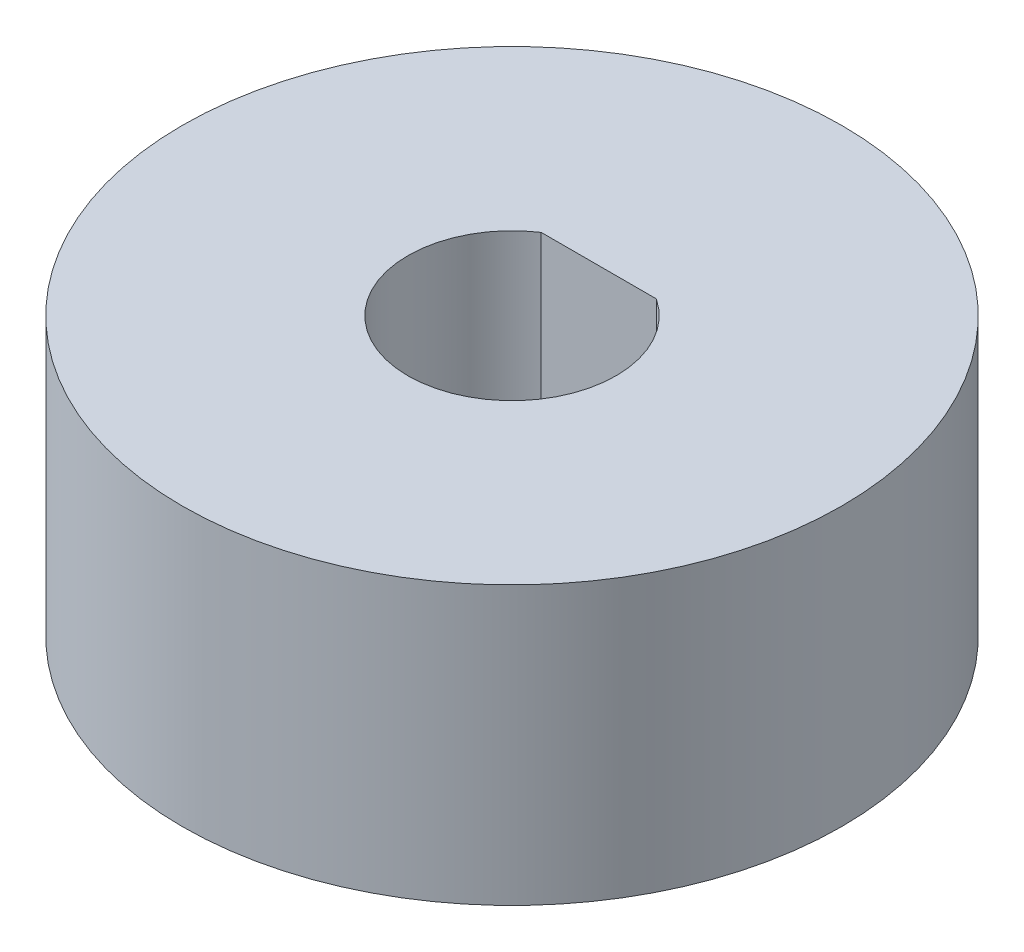
ISO-10303-21;
HEADER;
FILE_DESCRIPTION(('STEP AP214'),'2;1');
FILE_NAME('part.step','',(''),(''),'','','');
FILE_SCHEMA(('AUTOMOTIVE_DESIGN { 1 0 10303 214 1 1 1 1 }'));
ENDSEC;
DATA;
#1=APPLICATION_CONTEXT('core data for automotive mechanical design processes');
#2=APPLICATION_PROTOCOL_DEFINITION('international standard','automotive_design',2000,#1);
#3=PRODUCT_CONTEXT('',#1,'mechanical');
#4=PRODUCT('Part','Part','',(#3));
#5=PRODUCT_RELATED_PRODUCT_CATEGORY('part','',(#4));
#6=PRODUCT_DEFINITION_FORMATION('','',#4);
#7=PRODUCT_DEFINITION_CONTEXT('part definition',#1,'design');
#8=PRODUCT_DEFINITION('design','',#6,#7);
#9=PRODUCT_DEFINITION_SHAPE('','',#8);
#10=(LENGTH_UNIT() NAMED_UNIT(*) SI_UNIT(.MILLI.,.METRE.));
#11=(NAMED_UNIT(*) PLANE_ANGLE_UNIT() SI_UNIT($,.RADIAN.));
#12=(NAMED_UNIT(*) SI_UNIT($,.STERADIAN.) SOLID_ANGLE_UNIT());
#13=UNCERTAINTY_MEASURE_WITH_UNIT(LENGTH_MEASURE(1.E-05),#10,'distance_accuracy_value','');
#14=(GEOMETRIC_REPRESENTATION_CONTEXT(3) GLOBAL_UNCERTAINTY_ASSIGNED_CONTEXT((#13)) GLOBAL_UNIT_ASSIGNED_CONTEXT((#10,
#11,#12)) REPRESENTATION_CONTEXT('',''));
#15=CARTESIAN_POINT('',(0.,0.,0.));
#16=DIRECTION('',(0.,0.,1.));
#17=DIRECTION('',(1.,0.,0.));
#18=AXIS2_PLACEMENT_3D('',#15,#16,#17);
#19=CARTESIAN_POINT('',(0.,0.,0.));
#20=DIRECTION('',(0.,-1.,0.));
#21=DIRECTION('',(0.,0.,-1.));
#22=AXIS2_PLACEMENT_3D('',#19,#20,#21);
#23=CYLINDRICAL_SURFACE('',#22,3.);
#24=DIRECTION('',(0.,-1.,0.));
#25=VECTOR('',#24,1.);
#26=CARTESIAN_POINT('',(1.6583123951777,11.3541019662497,-2.5));
#27=LINE('',#26,#25);
#28=CARTESIAN_POINT('',(1.6583123951777,8.,-2.5));
#29=VERTEX_POINT('',#28);
#30=CARTESIAN_POINT('',(1.6583123951777,0.,-2.5));
#31=VERTEX_POINT('',#30);
#32=EDGE_CURVE('E80',#29,#31,#27,.T.);
#33=ORIENTED_EDGE('',*,*,#32,.T.);
#34=CARTESIAN_POINT('',(0.,0.,0.));
#35=DIRECTION('',(0.,-1.,0.));
#36=DIRECTION('',(0.,0.,-1.));
#37=AXIS2_PLACEMENT_3D('',#34,#35,#36);
#38=CIRCLE('',#37,3.);
#39=CARTESIAN_POINT('',(-1.6583123951777,0.,-2.5));
#40=VERTEX_POINT('',#39);
#41=EDGE_CURVE('E70',#31,#40,#38,.T.);
#42=ORIENTED_EDGE('',*,*,#41,.T.);
#43=DIRECTION('',(0.,-1.,0.));
#44=VECTOR('',#43,1.);
#45=CARTESIAN_POINT('',(-1.6583123951777,11.3541019662497,-2.5));
#46=LINE('',#45,#44);
#47=CARTESIAN_POINT('',(-1.6583123951777,8.,-2.5));
#48=VERTEX_POINT('',#47);
#49=EDGE_CURVE('E60',#48,#40,#46,.T.);
#50=ORIENTED_EDGE('',*,*,#49,.F.);
#51=CARTESIAN_POINT('',(0.,8.,0.));
#52=DIRECTION('',(0.,-1.,0.));
#53=DIRECTION('',(0.,0.,-1.));
#54=AXIS2_PLACEMENT_3D('',#51,#52,#53);
#55=CIRCLE('',#54,3.);
#56=EDGE_CURVE('E11',#29,#48,#55,.T.);
#57=ORIENTED_EDGE('',*,*,#56,.F.);
#58=EDGE_LOOP('',(#33,#42,#50,#57));
#59=FACE_BOUND('',#58,.T.);
#60=ADVANCED_FACE('F45',(#59),#23,.F.);
#61=CARTESIAN_POINT('',(-3.,8.,0.));
#62=DIRECTION('',(0.,-1.,0.));
#63=DIRECTION('',(0.,0.,-1.));
#64=AXIS2_PLACEMENT_3D('',#61,#62,#63);
#65=PLANE('',#64);
#66=CARTESIAN_POINT('',(0.,8.,0.));
#67=DIRECTION('',(0.,-1.,0.));
#68=DIRECTION('',(0.,0.,-1.));
#69=AXIS2_PLACEMENT_3D('',#66,#67,#68);
#70=CIRCLE('',#69,9.5);
#71=CARTESIAN_POINT('',(0.,8.,-9.5));
#72=VERTEX_POINT('',#71);
#73=EDGE_CURVE('E53',#72,#72,#70,.T.);
#74=ORIENTED_EDGE('',*,*,#73,.F.);
#75=EDGE_LOOP('',(#74));
#76=FACE_BOUND('',#75,.T.);
#77=ORIENTED_EDGE('',*,*,#56,.T.);
#78=DIRECTION('',(-1.,0.,0.));
#79=VECTOR('',#78,1.);
#80=CARTESIAN_POINT('',(0.,8.,-2.5));
#81=LINE('',#80,#79);
#82=EDGE_CURVE('E77',#29,#48,#81,.T.);
#83=ORIENTED_EDGE('',*,*,#82,.F.);
#84=EDGE_LOOP('',(#77,#83));
#85=FACE_BOUND('',#84,.T.);
#86=ADVANCED_FACE('F100',(#76,#85),#65,.F.);
#87=CARTESIAN_POINT('',(0.,0.,0.));
#88=DIRECTION('',(0.,-1.,0.));
#89=DIRECTION('',(0.,0.,-1.));
#90=AXIS2_PLACEMENT_3D('',#87,#88,#89);
#91=CYLINDRICAL_SURFACE('',#90,9.5);
#92=CARTESIAN_POINT('',(0.,0.,0.));
#93=DIRECTION('',(0.,-1.,0.));
#94=DIRECTION('',(0.,0.,-1.));
#95=AXIS2_PLACEMENT_3D('',#92,#93,#94);
#96=CIRCLE('',#95,9.5);
#97=CARTESIAN_POINT('',(0.,0.,-9.5));
#98=VERTEX_POINT('',#97);
#99=EDGE_CURVE('E76',#98,#98,#96,.T.);
#100=ORIENTED_EDGE('',*,*,#99,.F.);
#101=EDGE_LOOP('',(#100));
#102=FACE_BOUND('',#101,.T.);
#103=ORIENTED_EDGE('',*,*,#73,.T.);
#104=EDGE_LOOP('',(#103));
#105=FACE_BOUND('',#104,.T.);
#106=ADVANCED_FACE('F98',(#102,#105),#91,.T.);
#107=CARTESIAN_POINT('',(-3.,0.,0.));
#108=DIRECTION('',(0.,1.,0.));
#109=DIRECTION('',(0.,0.,1.));
#110=AXIS2_PLACEMENT_3D('',#107,#108,#109);
#111=PLANE('',#110);
#112=ORIENTED_EDGE('',*,*,#41,.F.);
#113=DIRECTION('',(1.,0.,0.));
#114=VECTOR('',#113,1.);
#115=CARTESIAN_POINT('',(0.,0.,-2.5));
#116=LINE('',#115,#114);
#117=EDGE_CURVE('E74',#40,#31,#116,.T.);
#118=ORIENTED_EDGE('',*,*,#117,.F.);
#119=EDGE_LOOP('',(#112,#118));
#120=FACE_BOUND('',#119,.T.);
#121=ORIENTED_EDGE('',*,*,#99,.T.);
#122=EDGE_LOOP('',(#121));
#123=FACE_BOUND('',#122,.T.);
#124=ADVANCED_FACE('F71',(#120,#123),#111,.F.);
#125=CARTESIAN_POINT('',(0.,11.3541019662497,-2.5));
#126=DIRECTION('',(0.,0.,-1.));
#127=DIRECTION('',(-1.,0.,0.));
#128=AXIS2_PLACEMENT_3D('',#125,#126,#127);
#129=PLANE('',#128);
#130=ORIENTED_EDGE('',*,*,#32,.F.);
#131=ORIENTED_EDGE('',*,*,#82,.T.);
#132=ORIENTED_EDGE('',*,*,#49,.T.);
#133=ORIENTED_EDGE('',*,*,#117,.T.);
#134=EDGE_LOOP('',(#130,#131,#132,#133));
#135=FACE_BOUND('',#134,.T.);
#136=ADVANCED_FACE('F85',(#135),#129,.F.);
#137=CLOSED_SHELL('',(#60,#86,#106,#124,#136));
#138=MANIFOLD_SOLID_BREP('B2',#137);
#139=ADVANCED_BREP_SHAPE_REPRESENTATION('',(#18,#138),#14);
#140=SHAPE_DEFINITION_REPRESENTATION(#9,#139);
ENDSEC;
END-ISO-10303-21;
